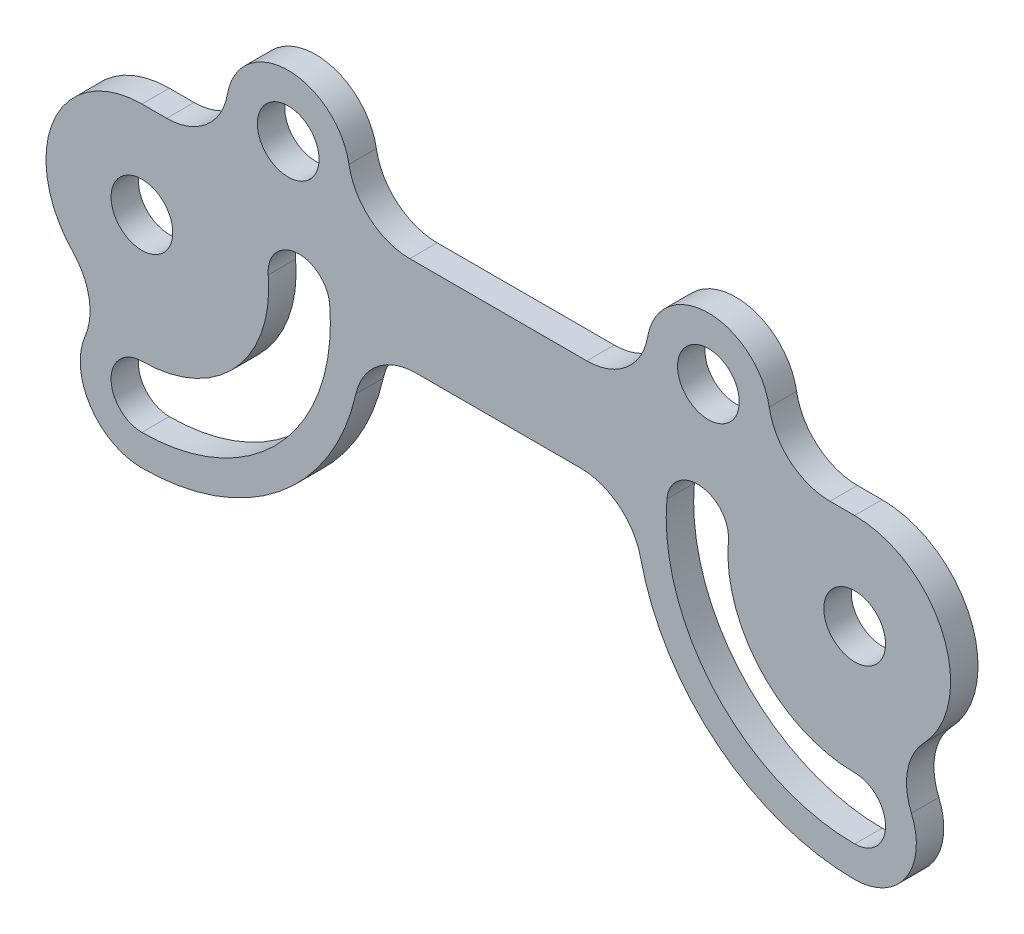
ISO-10303-21;
HEADER;
FILE_DESCRIPTION(('STEP AP214'),'2;1');
FILE_NAME('part.step','',(''),(''),'','','');
FILE_SCHEMA(('AUTOMOTIVE_DESIGN { 1 0 10303 214 1 1 1 1 }'));
ENDSEC;
DATA;
#1=APPLICATION_CONTEXT('core data for automotive mechanical design processes');
#2=APPLICATION_PROTOCOL_DEFINITION('international standard','automotive_design',2000,#1);
#3=PRODUCT_CONTEXT('',#1,'mechanical');
#4=PRODUCT('Part','Part','',(#3));
#5=PRODUCT_RELATED_PRODUCT_CATEGORY('part','',(#4));
#6=PRODUCT_DEFINITION_FORMATION('','',#4);
#7=PRODUCT_DEFINITION_CONTEXT('part definition',#1,'design');
#8=PRODUCT_DEFINITION('design','',#6,#7);
#9=PRODUCT_DEFINITION_SHAPE('','',#8);
#10=(LENGTH_UNIT() NAMED_UNIT(*) SI_UNIT(.MILLI.,.METRE.));
#11=(NAMED_UNIT(*) PLANE_ANGLE_UNIT() SI_UNIT($,.RADIAN.));
#12=(NAMED_UNIT(*) SI_UNIT($,.STERADIAN.) SOLID_ANGLE_UNIT());
#13=UNCERTAINTY_MEASURE_WITH_UNIT(LENGTH_MEASURE(1.E-05),#10,'distance_accuracy_value','');
#14=(GEOMETRIC_REPRESENTATION_CONTEXT(3) GLOBAL_UNCERTAINTY_ASSIGNED_CONTEXT((#13)) GLOBAL_UNIT_ASSIGNED_CONTEXT((#10,
#11,#12)) REPRESENTATION_CONTEXT('',''));
#15=CARTESIAN_POINT('',(0.,0.,0.));
#16=DIRECTION('',(0.,0.,1.));
#17=DIRECTION('',(1.,0.,0.));
#18=AXIS2_PLACEMENT_3D('',#15,#16,#17);
#19=CARTESIAN_POINT('',(0.,-9.128125,1.5875));
#20=DIRECTION('',(0.,0.,-1.));
#21=DIRECTION('',(-1.,0.,0.));
#22=AXIS2_PLACEMENT_3D('',#19,#20,#21);
#23=CYLINDRICAL_SURFACE('',#22,1.7859375);
#24=CARTESIAN_POINT('',(0.,-9.128125,0.));
#25=DIRECTION('',(0.,0.,1.));
#26=DIRECTION('',(1.,0.,0.));
#27=AXIS2_PLACEMENT_3D('',#24,#25,#26);
#28=CIRCLE('',#27,1.7859375);
#29=CARTESIAN_POINT('',(0.,-7.3421875,0.));
#30=VERTEX_POINT('',#29);
#31=CARTESIAN_POINT('',(0.,-10.9140625,0.));
#32=VERTEX_POINT('',#31);
#33=EDGE_CURVE('E346',#30,#32,#28,.T.);
#34=ORIENTED_EDGE('',*,*,#33,.F.);
#35=DIRECTION('',(0.,0.,-1.));
#36=VECTOR('',#35,1.);
#37=CARTESIAN_POINT('',(0.,-7.3421875,1.5875));
#38=LINE('',#37,#36);
#39=CARTESIAN_POINT('',(0.,-7.3421875,1.5875));
#40=VERTEX_POINT('',#39);
#41=EDGE_CURVE('E376',#40,#30,#38,.T.);
#42=ORIENTED_EDGE('',*,*,#41,.F.);
#43=CARTESIAN_POINT('',(0.,-9.128125,1.5875));
#44=DIRECTION('',(0.,0.,1.));
#45=DIRECTION('',(1.,0.,0.));
#46=AXIS2_PLACEMENT_3D('',#43,#44,#45);
#47=CIRCLE('',#46,1.7859375);
#48=CARTESIAN_POINT('',(0.,-10.9140625,1.5875));
#49=VERTEX_POINT('',#48);
#50=EDGE_CURVE('E282',#40,#49,#47,.T.);
#51=ORIENTED_EDGE('',*,*,#50,.T.);
#52=DIRECTION('',(0.,0.,-1.));
#53=VECTOR('',#52,1.);
#54=CARTESIAN_POINT('',(0.,-10.9140625,1.5875));
#55=LINE('',#54,#53);
#56=EDGE_CURVE('E369',#49,#32,#55,.T.);
#57=ORIENTED_EDGE('',*,*,#56,.T.);
#58=EDGE_LOOP('',(#34,#42,#51,#57));
#59=FACE_BOUND('',#58,.T.);
#60=ADVANCED_FACE('F38',(#59),#23,.F.);
#61=CARTESIAN_POINT('',(0.,0.,1.5875));
#62=DIRECTION('',(0.,0.,-1.));
#63=DIRECTION('',(-1.,0.,0.));
#64=AXIS2_PLACEMENT_3D('',#61,#62,#63);
#65=CYLINDRICAL_SURFACE('',#64,7.34218750000001);
#66=CARTESIAN_POINT('',(0.,0.,0.));
#67=DIRECTION('',(0.,0.,1.));
#68=DIRECTION('',(1.,0.,0.));
#69=AXIS2_PLACEMENT_3D('',#66,#67,#68);
#70=CIRCLE('',#69,7.34218750000001);
#71=CARTESIAN_POINT('',(7.31424825989548,0.6399138049551,0.));
#72=VERTEX_POINT('',#71);
#73=EDGE_CURVE('E349',#72,#30,#70,.F.);
#74=ORIENTED_EDGE('',*,*,#73,.F.);
#75=DIRECTION('',(0.,0.,-1.));
#76=VECTOR('',#75,1.);
#77=CARTESIAN_POINT('',(7.31424825989548,0.6399138049551,1.5875));
#78=LINE('',#77,#76);
#79=CARTESIAN_POINT('',(7.31424825989548,0.6399138049551,1.5875));
#80=VERTEX_POINT('',#79);
#81=EDGE_CURVE('E374',#80,#72,#78,.T.);
#82=ORIENTED_EDGE('',*,*,#81,.F.);
#83=CARTESIAN_POINT('',(0.,0.,1.5875));
#84=DIRECTION('',(0.,0.,1.));
#85=DIRECTION('',(1.,0.,0.));
#86=AXIS2_PLACEMENT_3D('',#83,#84,#85);
#87=CIRCLE('',#86,7.34218750000001);
#88=EDGE_CURVE('E285',#80,#40,#87,.F.);
#89=ORIENTED_EDGE('',*,*,#88,.T.);
#90=ORIENTED_EDGE('',*,*,#41,.T.);
#91=EDGE_LOOP('',(#74,#82,#89,#90));
#92=FACE_BOUND('',#91,.T.);
#93=ADVANCED_FACE('F519',(#92),#65,.T.);
#94=CARTESIAN_POINT('',(9.09338972851871,0.795568514268503,1.5875));
#95=DIRECTION('',(0.,0.,-1.));
#96=DIRECTION('',(-1.,0.,0.));
#97=AXIS2_PLACEMENT_3D('',#94,#95,#96);
#98=CYLINDRICAL_SURFACE('',#97,1.7859375);
#99=CARTESIAN_POINT('',(9.09338972851871,0.795568514268503,0.));
#100=DIRECTION('',(0.,0.,1.));
#101=DIRECTION('',(1.,0.,0.));
#102=AXIS2_PLACEMENT_3D('',#99,#100,#101);
#103=CIRCLE('',#102,1.7859375);
#104=CARTESIAN_POINT('',(10.8725311971419,0.951223223581906,0.));
#105=VERTEX_POINT('',#104);
#106=EDGE_CURVE('E352',#105,#72,#103,.T.);
#107=ORIENTED_EDGE('',*,*,#106,.F.);
#108=DIRECTION('',(0.,0.,-1.));
#109=VECTOR('',#108,1.);
#110=CARTESIAN_POINT('',(10.8725311971419,0.951223223581906,1.5875));
#111=LINE('',#110,#109);
#112=CARTESIAN_POINT('',(10.8725311971419,0.951223223581906,1.5875));
#113=VERTEX_POINT('',#112);
#114=EDGE_CURVE('E371',#113,#105,#111,.T.);
#115=ORIENTED_EDGE('',*,*,#114,.F.);
#116=CARTESIAN_POINT('',(9.09338972851871,0.795568514268503,1.5875));
#117=DIRECTION('',(0.,0.,1.));
#118=DIRECTION('',(1.,0.,0.));
#119=AXIS2_PLACEMENT_3D('',#116,#117,#118);
#120=CIRCLE('',#119,1.7859375);
#121=EDGE_CURVE('E288',#113,#80,#120,.T.);
#122=ORIENTED_EDGE('',*,*,#121,.T.);
#123=ORIENTED_EDGE('',*,*,#81,.T.);
#124=EDGE_LOOP('',(#107,#115,#122,#123));
#125=FACE_BOUND('',#124,.T.);
#126=ADVANCED_FACE('F525',(#125),#98,.F.);
#127=CARTESIAN_POINT('',(0.,0.,1.5875));
#128=DIRECTION('',(0.,0.,-1.));
#129=DIRECTION('',(-1.,0.,0.));
#130=AXIS2_PLACEMENT_3D('',#127,#128,#129);
#131=CYLINDRICAL_SURFACE('',#130,5.55625);
#132=CARTESIAN_POINT('',(0.,0.,0.));
#133=DIRECTION('',(0.,0.,1.));
#134=DIRECTION('',(1.,0.,0.));
#135=AXIS2_PLACEMENT_3D('',#132,#133,#134);
#136=CIRCLE('',#135,5.55625);
#137=CARTESIAN_POINT('',(0.,5.55625,0.));
#138=VERTEX_POINT('',#137);
#139=CARTESIAN_POINT('',(-4.00163634023209,-3.85471408317581,0.));
#140=VERTEX_POINT('',#139);
#141=EDGE_CURVE('E316',#138,#140,#136,.T.);
#142=ORIENTED_EDGE('',*,*,#141,.T.);
#143=DIRECTION('',(0.,0.,-1.));
#144=VECTOR('',#143,1.);
#145=CARTESIAN_POINT('',(-4.00163634023209,-3.85471408317581,1.5875));
#146=LINE('',#145,#144);
#147=CARTESIAN_POINT('',(-4.00163634023209,-3.85471408317581,1.5875));
#148=VERTEX_POINT('',#147);
#149=EDGE_CURVE('E426',#140,#148,#146,.F.);
#150=ORIENTED_EDGE('',*,*,#149,.T.);
#151=CARTESIAN_POINT('',(0.,0.,1.5875));
#152=DIRECTION('',(0.,0.,1.));
#153=DIRECTION('',(1.,0.,0.));
#154=AXIS2_PLACEMENT_3D('',#151,#152,#153);
#155=CIRCLE('',#154,5.55625);
#156=CARTESIAN_POINT('',(0.,5.55625,1.5875));
#157=VERTEX_POINT('',#156);
#158=EDGE_CURVE('E253',#157,#148,#155,.T.);
#159=ORIENTED_EDGE('',*,*,#158,.F.);
#160=DIRECTION('',(0.,0.,-1.));
#161=VECTOR('',#160,1.);
#162=CARTESIAN_POINT('',(0.,5.55625,1.5875));
#163=LINE('',#162,#161);
#164=EDGE_CURVE('E244',#157,#138,#163,.T.);
#165=ORIENTED_EDGE('',*,*,#164,.T.);
#166=EDGE_LOOP('',(#142,#150,#159,#165));
#167=FACE_BOUND('',#166,.T.);
#168=ADVANCED_FACE('F560',(#167),#131,.T.);
#169=CARTESIAN_POINT('',(0.,-9.128125,1.5875));
#170=DIRECTION('',(0.,0.,-1.));
#171=DIRECTION('',(-1.,0.,0.));
#172=AXIS2_PLACEMENT_3D('',#169,#170,#171);
#173=CYLINDRICAL_SURFACE('',#172,3.57187499999999);
#174=CARTESIAN_POINT('',(0.,-9.128125,1.5875));
#175=DIRECTION('',(0.,0.,1.));
#176=DIRECTION('',(1.,0.,0.));
#177=AXIS2_PLACEMENT_3D('',#174,#175,#176);
#178=CIRCLE('',#177,3.57187499999999);
#179=CARTESIAN_POINT('',(-3.2870584223335,-7.7304347826087,1.5875));
#180=VERTEX_POINT('',#179);
#181=CARTESIAN_POINT('',(0.,-12.7,1.5875));
#182=VERTEX_POINT('',#181);
#183=EDGE_CURVE('E256',#180,#182,#178,.T.);
#184=ORIENTED_EDGE('',*,*,#183,.F.);
#185=DIRECTION('',(0.,0.,-1.));
#186=VECTOR('',#185,1.);
#187=CARTESIAN_POINT('',(-3.2870584223335,-7.7304347826087,1.5875));
#188=LINE('',#187,#186);
#189=CARTESIAN_POINT('',(-3.2870584223335,-7.7304347826087,0.));
#190=VERTEX_POINT('',#189);
#191=EDGE_CURVE('E423',#180,#190,#188,.T.);
#192=ORIENTED_EDGE('',*,*,#191,.T.);
#193=CARTESIAN_POINT('',(0.,-9.128125,0.));
#194=DIRECTION('',(0.,0.,1.));
#195=DIRECTION('',(1.,0.,0.));
#196=AXIS2_PLACEMENT_3D('',#193,#194,#195);
#197=CIRCLE('',#196,3.57187499999999);
#198=CARTESIAN_POINT('',(0.,-12.7,0.));
#199=VERTEX_POINT('',#198);
#200=EDGE_CURVE('E319',#190,#199,#197,.T.);
#201=ORIENTED_EDGE('',*,*,#200,.T.);
#202=DIRECTION('',(0.,0.,-1.));
#203=VECTOR('',#202,1.);
#204=CARTESIAN_POINT('',(0.,-12.7,1.5875));
#205=LINE('',#204,#203);
#206=EDGE_CURVE('E372',#182,#199,#205,.T.);
#207=ORIENTED_EDGE('',*,*,#206,.F.);
#208=EDGE_LOOP('',(#184,#192,#201,#207));
#209=FACE_BOUND('',#208,.T.);
#210=ADVANCED_FACE('F556',(#209),#173,.T.);
#211=CARTESIAN_POINT('',(0.,0.,1.5875));
#212=DIRECTION('',(0.,0.,-1.));
#213=DIRECTION('',(-1.,0.,0.));
#214=AXIS2_PLACEMENT_3D('',#211,#212,#213);
#215=CYLINDRICAL_SURFACE('',#214,12.7);
#216=CARTESIAN_POINT('',(0.,0.,0.));
#217=DIRECTION('',(0.,0.,1.));
#218=DIRECTION('',(1.,0.,0.));
#219=AXIS2_PLACEMENT_3D('',#216,#217,#218);
#220=CIRCLE('',#219,12.7);
#221=CARTESIAN_POINT('',(12.390243902439,-2.78780487804878,0.));
#222=VERTEX_POINT('',#221);
#223=EDGE_CURVE('E321',#199,#222,#220,.T.);
#224=ORIENTED_EDGE('',*,*,#223,.T.);
#225=DIRECTION('',(0.,0.,-1.));
#226=VECTOR('',#225,1.);
#227=CARTESIAN_POINT('',(12.390243902439,-2.78780487804878,1.5875));
#228=LINE('',#227,#226);
#229=CARTESIAN_POINT('',(12.390243902439,-2.78780487804878,1.5875));
#230=VERTEX_POINT('',#229);
#231=EDGE_CURVE('E416',#222,#230,#228,.F.);
#232=ORIENTED_EDGE('',*,*,#231,.T.);
#233=CARTESIAN_POINT('',(0.,0.,1.5875));
#234=DIRECTION('',(0.,0.,1.));
#235=DIRECTION('',(1.,0.,0.));
#236=AXIS2_PLACEMENT_3D('',#233,#234,#235);
#237=CIRCLE('',#236,12.7);
#238=EDGE_CURVE('E258',#182,#230,#237,.T.);
#239=ORIENTED_EDGE('',*,*,#238,.F.);
#240=ORIENTED_EDGE('',*,*,#206,.T.);
#241=EDGE_LOOP('',(#224,#232,#239,#240));
#242=FACE_BOUND('',#241,.T.);
#243=ADVANCED_FACE('F552',(#242),#215,.T.);
#244=CARTESIAN_POINT('',(0.,0.,1.5875));
#245=DIRECTION('',(0.,1.,0.));
#246=DIRECTION('',(0.,0.,1.));
#247=AXIS2_PLACEMENT_3D('',#244,#245,#246);
#248=PLANE('',#247);
#249=DIRECTION('',(1.,0.,0.));
#250=VECTOR('',#249,1.);
#251=CARTESIAN_POINT('',(0.,0.,0.));
#252=LINE('',#251,#250);
#253=CARTESIAN_POINT('',(15.875,0.,0.));
#254=VERTEX_POINT('',#253);
#255=CARTESIAN_POINT('',(25.4000000000001,0.,0.));
#256=VERTEX_POINT('',#255);
#257=EDGE_CURVE('E324',#254,#256,#252,.T.);
#258=ORIENTED_EDGE('',*,*,#257,.T.);
#259=DIRECTION('',(0.,0.,1.));
#260=VECTOR('',#259,1.);
#261=CARTESIAN_POINT('',(25.4000000000001,0.,1.5875));
#262=LINE('',#261,#260);
#263=CARTESIAN_POINT('',(25.4000000000001,0.,1.5875));
#264=VERTEX_POINT('',#263);
#265=EDGE_CURVE('E414',#256,#264,#262,.T.);
#266=ORIENTED_EDGE('',*,*,#265,.T.);
#267=DIRECTION('',(1.,0.,0.));
#268=VECTOR('',#267,1.);
#269=CARTESIAN_POINT('',(0.,0.,1.5875));
#270=LINE('',#269,#268);
#271=CARTESIAN_POINT('',(15.875,0.,1.5875));
#272=VERTEX_POINT('',#271);
#273=EDGE_CURVE('E261',#272,#264,#270,.T.);
#274=ORIENTED_EDGE('',*,*,#273,.F.);
#275=DIRECTION('',(0.,0.,1.));
#276=VECTOR('',#275,1.);
#277=CARTESIAN_POINT('',(15.875,0.,0.));
#278=LINE('',#277,#276);
#279=EDGE_CURVE('E411',#272,#254,#278,.F.);
#280=ORIENTED_EDGE('',*,*,#279,.T.);
#281=EDGE_LOOP('',(#258,#266,#274,#280));
#282=FACE_BOUND('',#281,.T.);
#283=ADVANCED_FACE('F548',(#282),#248,.F.);
#284=CARTESIAN_POINT('',(41.275,0.,1.5875));
#285=DIRECTION('',(0.,0.,-1.));
#286=DIRECTION('',(-1.,0.,0.));
#287=AXIS2_PLACEMENT_3D('',#284,#285,#286);
#288=CYLINDRICAL_SURFACE('',#287,12.6999999999999);
#289=CARTESIAN_POINT('',(41.275,0.,1.5875));
#290=DIRECTION('',(0.,0.,1.));
#291=DIRECTION('',(1.,0.,0.));
#292=AXIS2_PLACEMENT_3D('',#289,#290,#291);
#293=CIRCLE('',#292,12.6999999999999);
#294=CARTESIAN_POINT('',(28.884756097561,-2.78780487804878,1.5875));
#295=VERTEX_POINT('',#294);
#296=CARTESIAN_POINT('',(41.275,-12.7,1.5875));
#297=VERTEX_POINT('',#296);
#298=EDGE_CURVE('E264',#295,#297,#293,.T.);
#299=ORIENTED_EDGE('',*,*,#298,.F.);
#300=DIRECTION('',(0.,0.,-1.));
#301=VECTOR('',#300,1.);
#302=CARTESIAN_POINT('',(28.884756097561,-2.78780487804878,1.5875));
#303=LINE('',#302,#301);
#304=CARTESIAN_POINT('',(28.884756097561,-2.78780487804878,0.));
#305=VERTEX_POINT('',#304);
#306=EDGE_CURVE('E408',#295,#305,#303,.T.);
#307=ORIENTED_EDGE('',*,*,#306,.T.);
#308=CARTESIAN_POINT('',(41.275,0.,0.));
#309=DIRECTION('',(0.,0.,1.));
#310=DIRECTION('',(1.,0.,0.));
#311=AXIS2_PLACEMENT_3D('',#308,#309,#310);
#312=CIRCLE('',#311,12.6999999999999);
#313=CARTESIAN_POINT('',(41.275,-12.7,0.));
#314=VERTEX_POINT('',#313);
#315=EDGE_CURVE('E327',#305,#314,#312,.T.);
#316=ORIENTED_EDGE('',*,*,#315,.T.);
#317=DIRECTION('',(0.,0.,-1.));
#318=VECTOR('',#317,1.);
#319=CARTESIAN_POINT('',(41.275,-12.7,1.5875));
#320=LINE('',#319,#318);
#321=EDGE_CURVE('E383',#297,#314,#320,.T.);
#322=ORIENTED_EDGE('',*,*,#321,.F.);
#323=EDGE_LOOP('',(#299,#307,#316,#322));
#324=FACE_BOUND('',#323,.T.);
#325=ADVANCED_FACE('F544',(#324),#288,.T.);
#326=CARTESIAN_POINT('',(41.275,-9.12812499999998,1.5875));
#327=DIRECTION('',(0.,0.,-1.));
#328=DIRECTION('',(-1.,0.,0.));
#329=AXIS2_PLACEMENT_3D('',#326,#327,#328);
#330=CYLINDRICAL_SURFACE('',#329,3.57187499999998);
#331=CARTESIAN_POINT('',(41.275,-9.12812499999998,0.));
#332=DIRECTION('',(0.,0.,1.));
#333=DIRECTION('',(1.,0.,0.));
#334=AXIS2_PLACEMENT_3D('',#331,#332,#333);
#335=CIRCLE('',#334,3.57187499999998);
#336=CARTESIAN_POINT('',(44.5620584223335,-7.73043478260869,0.));
#337=VERTEX_POINT('',#336);
#338=EDGE_CURVE('E329',#314,#337,#335,.T.);
#339=ORIENTED_EDGE('',*,*,#338,.T.);
#340=DIRECTION('',(0.,0.,-1.));
#341=VECTOR('',#340,1.);
#342=CARTESIAN_POINT('',(44.5620584223335,-7.73043478260869,1.5875));
#343=LINE('',#342,#341);
#344=CARTESIAN_POINT('',(44.5620584223335,-7.73043478260869,1.5875));
#345=VERTEX_POINT('',#344);
#346=EDGE_CURVE('E394',#337,#345,#343,.F.);
#347=ORIENTED_EDGE('',*,*,#346,.T.);
#348=CARTESIAN_POINT('',(41.275,-9.12812499999998,1.5875));
#349=DIRECTION('',(0.,0.,1.));
#350=DIRECTION('',(1.,0.,0.));
#351=AXIS2_PLACEMENT_3D('',#348,#349,#350);
#352=CIRCLE('',#351,3.57187499999998);
#353=EDGE_CURVE('E266',#297,#345,#352,.T.);
#354=ORIENTED_EDGE('',*,*,#353,.F.);
#355=ORIENTED_EDGE('',*,*,#321,.T.);
#356=EDGE_LOOP('',(#339,#347,#354,#355));
#357=FACE_BOUND('',#356,.T.);
#358=ADVANCED_FACE('F541',(#357),#330,.T.);
#359=CARTESIAN_POINT('',(41.275,0.,1.5875));
#360=DIRECTION('',(0.,0.,-1.));
#361=DIRECTION('',(-1.,0.,0.));
#362=AXIS2_PLACEMENT_3D('',#359,#360,#361);
#363=CYLINDRICAL_SURFACE('',#362,5.55624999999999);
#364=CARTESIAN_POINT('',(41.275,0.,1.5875));
#365=DIRECTION('',(0.,0.,1.));
#366=DIRECTION('',(1.,0.,0.));
#367=AXIS2_PLACEMENT_3D('',#364,#365,#366);
#368=CIRCLE('',#367,5.55624999999999);
#369=CARTESIAN_POINT('',(45.2766363402321,-3.8547140831758,1.5875));
#370=VERTEX_POINT('',#369);
#371=CARTESIAN_POINT('',(41.275,5.55625,1.5875));
#372=VERTEX_POINT('',#371);
#373=EDGE_CURVE('E269',#370,#372,#368,.T.);
#374=ORIENTED_EDGE('',*,*,#373,.F.);
#375=DIRECTION('',(0.,0.,-1.));
#376=VECTOR('',#375,1.);
#377=CARTESIAN_POINT('',(45.2766363402321,-3.8547140831758,1.5875));
#378=LINE('',#377,#376);
#379=CARTESIAN_POINT('',(45.2766363402321,-3.8547140831758,0.));
#380=VERTEX_POINT('',#379);
#381=EDGE_CURVE('E378',#370,#380,#378,.T.);
#382=ORIENTED_EDGE('',*,*,#381,.T.);
#383=CARTESIAN_POINT('',(41.275,0.,0.));
#384=DIRECTION('',(0.,0.,1.));
#385=DIRECTION('',(1.,0.,0.));
#386=AXIS2_PLACEMENT_3D('',#383,#384,#385);
#387=CIRCLE('',#386,5.55624999999999);
#388=CARTESIAN_POINT('',(41.275,5.55625,0.));
#389=VERTEX_POINT('',#388);
#390=EDGE_CURVE('E332',#380,#389,#387,.T.);
#391=ORIENTED_EDGE('',*,*,#390,.T.);
#392=DIRECTION('',(0.,0.,-1.));
#393=VECTOR('',#392,1.);
#394=CARTESIAN_POINT('',(41.275,5.55625,1.5875));
#395=LINE('',#394,#393);
#396=EDGE_CURVE('E380',#372,#389,#395,.T.);
#397=ORIENTED_EDGE('',*,*,#396,.F.);
#398=EDGE_LOOP('',(#374,#382,#391,#397));
#399=FACE_BOUND('',#398,.T.);
#400=ADVANCED_FACE('F483',(#399),#363,.T.);
#401=CARTESIAN_POINT('',(0.,5.55625,1.5875));
#402=DIRECTION('',(0.,1.,0.));
#403=DIRECTION('',(0.,0.,1.));
#404=AXIS2_PLACEMENT_3D('',#401,#402,#403);
#405=PLANE('',#404);
#406=DIRECTION('',(1.,0.,0.));
#407=VECTOR('',#406,1.);
#408=CARTESIAN_POINT('',(0.,5.55625,0.));
#409=LINE('',#408,#407);
#410=CARTESIAN_POINT('',(39.8437270237769,5.55625,0.));
#411=VERTEX_POINT('',#410);
#412=EDGE_CURVE('E335',#411,#389,#409,.T.);
#413=ORIENTED_EDGE('',*,*,#412,.F.);
#414=DIRECTION('',(0.,0.,-1.));
#415=VECTOR('',#414,1.);
#416=CARTESIAN_POINT('',(39.8437270237769,5.55625,1.5875));
#417=LINE('',#416,#415);
#418=CARTESIAN_POINT('',(39.8437270237769,5.55625,1.5875));
#419=VERTEX_POINT('',#418);
#420=EDGE_CURVE('E401',#411,#419,#417,.F.);
#421=ORIENTED_EDGE('',*,*,#420,.T.);
#422=DIRECTION('',(1.,0.,0.));
#423=VECTOR('',#422,1.);
#424=CARTESIAN_POINT('',(0.,5.55625,1.5875));
#425=LINE('',#424,#423);
#426=EDGE_CURVE('E272',#419,#372,#425,.T.);
#427=ORIENTED_EDGE('',*,*,#426,.T.);
#428=ORIENTED_EDGE('',*,*,#396,.T.);
#429=EDGE_LOOP('',(#413,#421,#427,#428));
#430=FACE_BOUND('',#429,.T.);
#431=ADVANCED_FACE('F474',(#430),#405,.T.);
#432=CARTESIAN_POINT('',(32.8042291087349,7.91213438876142,1.5875));
#433=DIRECTION('',(0.,0.,-1.));
#434=DIRECTION('',(-1.,0.,0.));
#435=AXIS2_PLACEMENT_3D('',#432,#433,#434);
#436=CYLINDRICAL_SURFACE('',#435,3.57187500000001);
#437=CARTESIAN_POINT('',(32.8042291087349,7.91213438876142,1.5875));
#438=DIRECTION('',(0.,0.,1.));
#439=DIRECTION('',(1.,0.,0.));
#440=AXIS2_PLACEMENT_3D('',#437,#438,#439);
#441=CIRCLE('',#440,3.57187500000001);
#442=CARTESIAN_POINT('',(36.3239780662559,8.52012969438071,1.5875));
#443=VERTEX_POINT('',#442);
#444=CARTESIAN_POINT('',(29.2844801512139,8.52012969438071,1.5875));
#445=VERTEX_POINT('',#444);
#446=EDGE_CURVE('E277',#443,#445,#441,.T.);
#447=ORIENTED_EDGE('',*,*,#446,.F.);
#448=DIRECTION('',(0.,0.,-1.));
#449=VECTOR('',#448,1.);
#450=CARTESIAN_POINT('',(36.3239780662559,8.52012969438071,1.5875));
#451=LINE('',#450,#449);
#452=CARTESIAN_POINT('',(36.3239780662559,8.52012969438071,0.));
#453=VERTEX_POINT('',#452);
#454=EDGE_CURVE('E398',#443,#453,#451,.T.);
#455=ORIENTED_EDGE('',*,*,#454,.T.);
#456=CARTESIAN_POINT('',(32.8042291087349,7.91213438876142,0.));
#457=DIRECTION('',(0.,0.,1.));
#458=DIRECTION('',(1.,0.,0.));
#459=AXIS2_PLACEMENT_3D('',#456,#457,#458);
#460=CIRCLE('',#459,3.57187500000001);
#461=CARTESIAN_POINT('',(29.2844801512139,8.52012969438071,0.));
#462=VERTEX_POINT('',#461);
#463=EDGE_CURVE('E340',#453,#462,#460,.T.);
#464=ORIENTED_EDGE('',*,*,#463,.T.);
#465=DIRECTION('',(0.,0.,-1.));
#466=VECTOR('',#465,1.);
#467=CARTESIAN_POINT('',(29.2844801512139,8.52012969438071,1.5875));
#468=LINE('',#467,#466);
#469=EDGE_CURVE('E396',#462,#445,#468,.F.);
#470=ORIENTED_EDGE('',*,*,#469,.T.);
#471=EDGE_LOOP('',(#447,#455,#464,#470));
#472=FACE_BOUND('',#471,.T.);
#473=ADVANCED_FACE('F493',(#472),#436,.T.);
#474=CARTESIAN_POINT('',(15.510268806307,5.55625,1.5875));
#475=VERTEX_POINT('',#474);
#476=CARTESIAN_POINT('',(25.764731193693,5.55625,1.5875));
#477=VERTEX_POINT('',#476);
#478=EDGE_CURVE('E273',#475,#477,#425,.T.);
#479=ORIENTED_EDGE('',*,*,#478,.T.);
#480=DIRECTION('',(0.,0.,-1.));
#481=VECTOR('',#480,1.);
#482=CARTESIAN_POINT('',(25.764731193693,5.55625,1.5875));
#483=LINE('',#482,#481);
#484=CARTESIAN_POINT('',(25.764731193693,5.55625,0.));
#485=VERTEX_POINT('',#484);
#486=EDGE_CURVE('E405',#477,#485,#483,.T.);
#487=ORIENTED_EDGE('',*,*,#486,.T.);
#488=CARTESIAN_POINT('',(15.510268806307,5.55625,0.));
#489=VERTEX_POINT('',#488);
#490=EDGE_CURVE('E336',#489,#485,#409,.T.);
#491=ORIENTED_EDGE('',*,*,#490,.F.);
#492=DIRECTION('',(0.,0.,-1.));
#493=VECTOR('',#492,1.);
#494=CARTESIAN_POINT('',(15.510268806307,5.55625,1.5875));
#495=LINE('',#494,#493);
#496=EDGE_CURVE('E403',#489,#475,#495,.F.);
#497=ORIENTED_EDGE('',*,*,#496,.T.);
#498=EDGE_LOOP('',(#479,#487,#491,#497));
#499=FACE_BOUND('',#498,.T.);
#500=ADVANCED_FACE('F501',(#499),#405,.T.);
#501=CARTESIAN_POINT('',(8.4707708912651,7.91213438876139,1.5875));
#502=DIRECTION('',(0.,0.,-1.));
#503=DIRECTION('',(-1.,0.,0.));
#504=AXIS2_PLACEMENT_3D('',#501,#502,#503);
#505=CYLINDRICAL_SURFACE('',#504,3.57187499999998);
#506=CARTESIAN_POINT('',(8.4707708912651,7.91213438876139,1.5875));
#507=DIRECTION('',(0.,0.,1.));
#508=DIRECTION('',(1.,0.,0.));
#509=AXIS2_PLACEMENT_3D('',#506,#507,#508);
#510=CIRCLE('',#509,3.57187499999998);
#511=CARTESIAN_POINT('',(11.990519848786,8.52012969438069,1.5875));
#512=VERTEX_POINT('',#511);
#513=CARTESIAN_POINT('',(4.95102193374416,8.52012969438069,1.5875));
#514=VERTEX_POINT('',#513);
#515=EDGE_CURVE('E276',#512,#514,#510,.T.);
#516=ORIENTED_EDGE('',*,*,#515,.F.);
#517=DIRECTION('',(0.,0.,-1.));
#518=VECTOR('',#517,1.);
#519=CARTESIAN_POINT('',(11.990519848786,8.52012969438069,1.5875));
#520=LINE('',#519,#518);
#521=CARTESIAN_POINT('',(11.990519848786,8.52012969438069,0.));
#522=VERTEX_POINT('',#521);
#523=EDGE_CURVE('E420',#512,#522,#520,.T.);
#524=ORIENTED_EDGE('',*,*,#523,.T.);
#525=CARTESIAN_POINT('',(8.4707708912651,7.91213438876139,0.));
#526=DIRECTION('',(0.,0.,1.));
#527=DIRECTION('',(1.,0.,0.));
#528=AXIS2_PLACEMENT_3D('',#525,#526,#527);
#529=CIRCLE('',#528,3.57187499999998);
#530=CARTESIAN_POINT('',(4.95102193374416,8.52012969438069,0.));
#531=VERTEX_POINT('',#530);
#532=EDGE_CURVE('E339',#522,#531,#529,.T.);
#533=ORIENTED_EDGE('',*,*,#532,.T.);
#534=DIRECTION('',(0.,0.,-1.));
#535=VECTOR('',#534,1.);
#536=CARTESIAN_POINT('',(4.95102193374416,8.52012969438069,1.5875));
#537=LINE('',#536,#535);
#538=EDGE_CURVE('E418',#531,#514,#537,.F.);
#539=ORIENTED_EDGE('',*,*,#538,.T.);
#540=EDGE_LOOP('',(#516,#524,#533,#539));
#541=FACE_BOUND('',#540,.T.);
#542=ADVANCED_FACE('F466',(#541),#505,.T.);
#543=CARTESIAN_POINT('',(41.275,0.,1.5875));
#544=DIRECTION('',(0.,0.,-1.));
#545=DIRECTION('',(-1.,0.,0.));
#546=AXIS2_PLACEMENT_3D('',#543,#544,#545);
#547=CYLINDRICAL_SURFACE('',#546,7.34218749999998);
#548=CARTESIAN_POINT('',(41.275,0.,0.));
#549=DIRECTION('',(0.,0.,1.));
#550=DIRECTION('',(1.,0.,0.));
#551=AXIS2_PLACEMENT_3D('',#548,#549,#550);
#552=CIRCLE('',#551,7.34218749999998);
#553=CARTESIAN_POINT('',(33.9607517401045,0.639913804955094,0.));
#554=VERTEX_POINT('',#553);
#555=CARTESIAN_POINT('',(41.275,-7.34218749999998,0.));
#556=VERTEX_POINT('',#555);
#557=EDGE_CURVE('E240',#554,#556,#552,.T.);
#558=ORIENTED_EDGE('',*,*,#557,.T.);
#559=DIRECTION('',(0.,0.,-1.));
#560=VECTOR('',#559,1.);
#561=CARTESIAN_POINT('',(41.275,-7.34218749999998,1.5875));
#562=LINE('',#561,#560);
#563=CARTESIAN_POINT('',(41.275,-7.34218749999998,1.5875));
#564=VERTEX_POINT('',#563);
#565=EDGE_CURVE('E237',#564,#556,#562,.T.);
#566=ORIENTED_EDGE('',*,*,#565,.F.);
#567=CARTESIAN_POINT('',(41.275,0.,1.5875));
#568=DIRECTION('',(0.,0.,1.));
#569=DIRECTION('',(1.,0.,0.));
#570=AXIS2_PLACEMENT_3D('',#567,#568,#569);
#571=CIRCLE('',#570,7.34218749999998);
#572=CARTESIAN_POINT('',(33.9607517401045,0.639913804955094,1.5875));
#573=VERTEX_POINT('',#572);
#574=EDGE_CURVE('E224',#573,#564,#571,.T.);
#575=ORIENTED_EDGE('',*,*,#574,.F.);
#576=DIRECTION('',(0.,0.,-1.));
#577=VECTOR('',#576,1.);
#578=CARTESIAN_POINT('',(33.9607517401045,0.639913804955094,1.5875));
#579=LINE('',#578,#577);
#580=EDGE_CURVE('E306',#573,#554,#579,.T.);
#581=ORIENTED_EDGE('',*,*,#580,.T.);
#582=EDGE_LOOP('',(#558,#566,#575,#581));
#583=FACE_BOUND('',#582,.T.);
#584=ADVANCED_FACE('F238',(#583),#547,.T.);
#585=CARTESIAN_POINT('',(41.275,-9.12812499999998,1.5875));
#586=DIRECTION('',(0.,0.,-1.));
#587=DIRECTION('',(-1.,0.,0.));
#588=AXIS2_PLACEMENT_3D('',#585,#586,#587);
#589=CYLINDRICAL_SURFACE('',#588,1.7859375);
#590=CARTESIAN_POINT('',(41.275,-9.12812499999998,0.));
#591=DIRECTION('',(0.,0.,1.));
#592=DIRECTION('',(1.,0.,0.));
#593=AXIS2_PLACEMENT_3D('',#590,#591,#592);
#594=CIRCLE('',#593,1.7859375);
#595=CARTESIAN_POINT('',(41.275,-10.9140625,0.));
#596=VERTEX_POINT('',#595);
#597=EDGE_CURVE('E308',#596,#556,#594,.T.);
#598=ORIENTED_EDGE('',*,*,#597,.F.);
#599=DIRECTION('',(0.,0.,-1.));
#600=VECTOR('',#599,1.);
#601=CARTESIAN_POINT('',(41.275,-10.9140625,1.5875));
#602=LINE('',#601,#600);
#603=CARTESIAN_POINT('',(41.275,-10.9140625,1.5875));
#604=VERTEX_POINT('',#603);
#605=EDGE_CURVE('E245',#604,#596,#602,.T.);
#606=ORIENTED_EDGE('',*,*,#605,.F.);
#607=CARTESIAN_POINT('',(41.275,-9.12812499999998,1.5875));
#608=DIRECTION('',(0.,0.,1.));
#609=DIRECTION('',(1.,0.,0.));
#610=AXIS2_PLACEMENT_3D('',#607,#608,#609);
#611=CIRCLE('',#610,1.7859375);
#612=EDGE_CURVE('E229',#604,#564,#611,.T.);
#613=ORIENTED_EDGE('',*,*,#612,.T.);
#614=ORIENTED_EDGE('',*,*,#565,.T.);
#615=EDGE_LOOP('',(#598,#606,#613,#614));
#616=FACE_BOUND('',#615,.T.);
#617=ADVANCED_FACE('F247',(#616),#589,.F.);
#618=CARTESIAN_POINT('',(41.275,0.,1.5875));
#619=DIRECTION('',(0.,0.,-1.));
#620=DIRECTION('',(-1.,0.,0.));
#621=AXIS2_PLACEMENT_3D('',#618,#619,#620);
#622=CYLINDRICAL_SURFACE('',#621,10.9140625);
#623=CARTESIAN_POINT('',(41.275,0.,0.));
#624=DIRECTION('',(0.,0.,1.));
#625=DIRECTION('',(1.,0.,0.));
#626=AXIS2_PLACEMENT_3D('',#623,#624,#625);
#627=CIRCLE('',#626,10.9140625);
#628=CARTESIAN_POINT('',(30.4024688028581,0.951223223581898,0.));
#629=VERTEX_POINT('',#628);
#630=EDGE_CURVE('E310',#629,#596,#627,.T.);
#631=ORIENTED_EDGE('',*,*,#630,.F.);
#632=DIRECTION('',(0.,0.,-1.));
#633=VECTOR('',#632,1.);
#634=CARTESIAN_POINT('',(30.4024688028581,0.951223223581898,1.5875));
#635=LINE('',#634,#633);
#636=CARTESIAN_POINT('',(30.4024688028581,0.951223223581898,1.5875));
#637=VERTEX_POINT('',#636);
#638=EDGE_CURVE('E389',#637,#629,#635,.T.);
#639=ORIENTED_EDGE('',*,*,#638,.F.);
#640=CARTESIAN_POINT('',(41.275,0.,1.5875));
#641=DIRECTION('',(0.,0.,1.));
#642=DIRECTION('',(1.,0.,0.));
#643=AXIS2_PLACEMENT_3D('',#640,#641,#642);
#644=CIRCLE('',#643,10.9140625);
#645=EDGE_CURVE('E248',#637,#604,#644,.T.);
#646=ORIENTED_EDGE('',*,*,#645,.T.);
#647=ORIENTED_EDGE('',*,*,#605,.T.);
#648=EDGE_LOOP('',(#631,#639,#646,#647));
#649=FACE_BOUND('',#648,.T.);
#650=ADVANCED_FACE('F569',(#649),#622,.F.);
#651=CARTESIAN_POINT('',(8.4707708912651,7.91213438876139,1.5875));
#652=DIRECTION('',(0.,0.,-1.));
#653=DIRECTION('',(-1.,0.,0.));
#654=AXIS2_PLACEMENT_3D('',#651,#652,#653);
#655=CYLINDRICAL_SURFACE('',#654,1.78593749999998);
#656=CARTESIAN_POINT('',(8.4707708912651,7.91213438876139,1.5875));
#657=DIRECTION('',(0.,0.,1.));
#658=DIRECTION('',(1.,0.,0.));
#659=AXIS2_PLACEMENT_3D('',#656,#657,#658);
#660=CIRCLE('',#659,1.78593749999998);
#661=CARTESIAN_POINT('',(10.2567083912651,7.91213438876139,1.5875));
#662=VERTEX_POINT('',#661);
#663=EDGE_CURVE('E300',#662,#662,#660,.T.);
#664=ORIENTED_EDGE('',*,*,#663,.T.);
#665=EDGE_LOOP('',(#664));
#666=FACE_BOUND('',#665,.T.);
#667=CARTESIAN_POINT('',(8.4707708912651,7.91213438876139,0.));
#668=DIRECTION('',(0.,0.,1.));
#669=DIRECTION('',(1.,0.,0.));
#670=AXIS2_PLACEMENT_3D('',#667,#668,#669);
#671=CIRCLE('',#670,1.78593749999998);
#672=CARTESIAN_POINT('',(10.2567083912651,7.91213438876139,0.));
#673=VERTEX_POINT('',#672);
#674=EDGE_CURVE('E364',#673,#673,#671,.T.);
#675=ORIENTED_EDGE('',*,*,#674,.F.);
#676=EDGE_LOOP('',(#675));
#677=FACE_BOUND('',#676,.T.);
#678=ADVANCED_FACE('F572',(#666,#677),#655,.F.);
#679=CARTESIAN_POINT('',(41.275,0.,1.5875));
#680=DIRECTION('',(0.,0.,-1.));
#681=DIRECTION('',(-1.,0.,0.));
#682=AXIS2_PLACEMENT_3D('',#679,#680,#681);
#683=CYLINDRICAL_SURFACE('',#682,1.7859375);
#684=CARTESIAN_POINT('',(41.275,0.,1.5875));
#685=DIRECTION('',(0.,0.,1.));
#686=DIRECTION('',(1.,0.,0.));
#687=AXIS2_PLACEMENT_3D('',#684,#685,#686);
#688=CIRCLE('',#687,1.7859375);
#689=CARTESIAN_POINT('',(43.0609375,0.,1.5875));
#690=VERTEX_POINT('',#689);
#691=EDGE_CURVE('E297',#690,#690,#688,.T.);
#692=ORIENTED_EDGE('',*,*,#691,.T.);
#693=EDGE_LOOP('',(#692));
#694=FACE_BOUND('',#693,.T.);
#695=CARTESIAN_POINT('',(41.275,0.,0.));
#696=DIRECTION('',(0.,0.,1.));
#697=DIRECTION('',(1.,0.,0.));
#698=AXIS2_PLACEMENT_3D('',#695,#696,#697);
#699=CIRCLE('',#698,1.7859375);
#700=CARTESIAN_POINT('',(43.0609375,0.,0.));
#701=VERTEX_POINT('',#700);
#702=EDGE_CURVE('E361',#701,#701,#699,.T.);
#703=ORIENTED_EDGE('',*,*,#702,.F.);
#704=EDGE_LOOP('',(#703));
#705=FACE_BOUND('',#704,.T.);
#706=ADVANCED_FACE('F786',(#694,#705),#683,.F.);
#707=CARTESIAN_POINT('',(0.,0.,1.5875));
#708=DIRECTION('',(0.,0.,-1.));
#709=DIRECTION('',(-1.,0.,0.));
#710=AXIS2_PLACEMENT_3D('',#707,#708,#709);
#711=CYLINDRICAL_SURFACE('',#710,1.7859375);
#712=CARTESIAN_POINT('',(0.,0.,1.5875));
#713=DIRECTION('',(0.,0.,1.));
#714=DIRECTION('',(1.,0.,0.));
#715=AXIS2_PLACEMENT_3D('',#712,#713,#714);
#716=CIRCLE('',#715,1.7859375);
#717=CARTESIAN_POINT('',(1.7859375,0.,1.5875));
#718=VERTEX_POINT('',#717);
#719=EDGE_CURVE('E294',#718,#718,#716,.T.);
#720=ORIENTED_EDGE('',*,*,#719,.T.);
#721=EDGE_LOOP('',(#720));
#722=FACE_BOUND('',#721,.T.);
#723=CARTESIAN_POINT('',(0.,0.,0.));
#724=DIRECTION('',(0.,0.,1.));
#725=DIRECTION('',(1.,0.,0.));
#726=AXIS2_PLACEMENT_3D('',#723,#724,#725);
#727=CIRCLE('',#726,1.7859375);
#728=CARTESIAN_POINT('',(1.7859375,0.,0.));
#729=VERTEX_POINT('',#728);
#730=EDGE_CURVE('E358',#729,#729,#727,.T.);
#731=ORIENTED_EDGE('',*,*,#730,.F.);
#732=EDGE_LOOP('',(#731));
#733=FACE_BOUND('',#732,.T.);
#734=ADVANCED_FACE('F776',(#722,#733),#711,.F.);
#735=CARTESIAN_POINT('',(0.,0.,1.5875));
#736=DIRECTION('',(0.,0.,-1.));
#737=DIRECTION('',(-1.,0.,0.));
#738=AXIS2_PLACEMENT_3D('',#735,#736,#737);
#739=CYLINDRICAL_SURFACE('',#738,10.9140625);
#740=CARTESIAN_POINT('',(0.,0.,0.));
#741=DIRECTION('',(0.,0.,1.));
#742=DIRECTION('',(1.,0.,0.));
#743=AXIS2_PLACEMENT_3D('',#740,#741,#742);
#744=CIRCLE('',#743,10.9140625);
#745=EDGE_CURVE('E355',#32,#105,#744,.T.);
#746=ORIENTED_EDGE('',*,*,#745,.F.);
#747=ORIENTED_EDGE('',*,*,#56,.F.);
#748=CARTESIAN_POINT('',(0.,0.,1.5875));
#749=DIRECTION('',(0.,0.,1.));
#750=DIRECTION('',(1.,0.,0.));
#751=AXIS2_PLACEMENT_3D('',#748,#749,#750);
#752=CIRCLE('',#751,10.9140625);
#753=EDGE_CURVE('E291',#49,#113,#752,.T.);
#754=ORIENTED_EDGE('',*,*,#753,.T.);
#755=ORIENTED_EDGE('',*,*,#114,.T.);
#756=EDGE_LOOP('',(#746,#747,#754,#755));
#757=FACE_BOUND('',#756,.T.);
#758=ADVANCED_FACE('F534',(#757),#739,.F.);
#759=CARTESIAN_POINT('',(1.4312729762232,5.55625,1.5875));
#760=VERTEX_POINT('',#759);
#761=EDGE_CURVE('E278',#157,#760,#425,.T.);
#762=ORIENTED_EDGE('',*,*,#761,.T.);
#763=DIRECTION('',(0.,0.,-1.));
#764=VECTOR('',#763,1.);
#765=CARTESIAN_POINT('',(1.4312729762232,5.55625,1.5875));
#766=LINE('',#765,#764);
#767=CARTESIAN_POINT('',(1.4312729762232,5.55625,0.));
#768=VERTEX_POINT('',#767);
#769=EDGE_CURVE('E428',#760,#768,#766,.T.);
#770=ORIENTED_EDGE('',*,*,#769,.T.);
#771=EDGE_CURVE('E341',#138,#768,#409,.T.);
#772=ORIENTED_EDGE('',*,*,#771,.F.);
#773=ORIENTED_EDGE('',*,*,#164,.F.);
#774=EDGE_LOOP('',(#762,#770,#772,#773));
#775=FACE_BOUND('',#774,.T.);
#776=ADVANCED_FACE('F469',(#775),#405,.T.);
#777=CARTESIAN_POINT('',(32.1816102714813,0.795568514268496,1.5875));
#778=DIRECTION('',(0.,0.,-1.));
#779=DIRECTION('',(-1.,0.,0.));
#780=AXIS2_PLACEMENT_3D('',#777,#778,#779);
#781=CYLINDRICAL_SURFACE('',#780,1.7859375);
#782=CARTESIAN_POINT('',(32.1816102714813,0.795568514268496,0.));
#783=DIRECTION('',(0.,0.,1.));
#784=DIRECTION('',(1.,0.,0.));
#785=AXIS2_PLACEMENT_3D('',#782,#783,#784);
#786=CIRCLE('',#785,1.7859375);
#787=EDGE_CURVE('E313',#554,#629,#786,.T.);
#788=ORIENTED_EDGE('',*,*,#787,.F.);
#789=ORIENTED_EDGE('',*,*,#580,.F.);
#790=CARTESIAN_POINT('',(32.1816102714813,0.795568514268496,1.5875));
#791=DIRECTION('',(0.,0.,1.));
#792=DIRECTION('',(1.,0.,0.));
#793=AXIS2_PLACEMENT_3D('',#790,#791,#792);
#794=CIRCLE('',#793,1.7859375);
#795=EDGE_CURVE('E232',#573,#637,#794,.T.);
#796=ORIENTED_EDGE('',*,*,#795,.T.);
#797=ORIENTED_EDGE('',*,*,#638,.T.);
#798=EDGE_LOOP('',(#788,#789,#796,#797));
#799=FACE_BOUND('',#798,.T.);
#800=ADVANCED_FACE('F533',(#799),#781,.F.);
#801=CARTESIAN_POINT('',(32.8042291087349,7.91213438876142,1.5875));
#802=DIRECTION('',(0.,0.,-1.));
#803=DIRECTION('',(-1.,0.,0.));
#804=AXIS2_PLACEMENT_3D('',#801,#802,#803);
#805=CYLINDRICAL_SURFACE('',#804,1.78593750000002);
#806=CARTESIAN_POINT('',(32.8042291087349,7.91213438876142,1.5875));
#807=DIRECTION('',(0.,0.,1.));
#808=DIRECTION('',(1.,0.,0.));
#809=AXIS2_PLACEMENT_3D('',#806,#807,#808);
#810=CIRCLE('',#809,1.78593750000002);
#811=CARTESIAN_POINT('',(34.5901666087349,7.91213438876142,1.5875));
#812=VERTEX_POINT('',#811);
#813=EDGE_CURVE('E303',#812,#812,#810,.T.);
#814=ORIENTED_EDGE('',*,*,#813,.T.);
#815=EDGE_LOOP('',(#814));
#816=FACE_BOUND('',#815,.T.);
#817=CARTESIAN_POINT('',(32.8042291087349,7.91213438876142,0.));
#818=DIRECTION('',(0.,0.,1.));
#819=DIRECTION('',(1.,0.,0.));
#820=AXIS2_PLACEMENT_3D('',#817,#818,#819);
#821=CIRCLE('',#820,1.78593750000002);
#822=CARTESIAN_POINT('',(34.5901666087349,7.91213438876142,0.));
#823=VERTEX_POINT('',#822);
#824=EDGE_CURVE('E234',#823,#823,#821,.T.);
#825=ORIENTED_EDGE('',*,*,#824,.F.);
#826=EDGE_LOOP('',(#825));
#827=FACE_BOUND('',#826,.T.);
#828=ADVANCED_FACE('F567',(#816,#827),#805,.F.);
#829=CARTESIAN_POINT('',(0.,0.,1.5875));
#830=DIRECTION('',(0.,0.,1.));
#831=DIRECTION('',(1.,0.,0.));
#832=AXIS2_PLACEMENT_3D('',#829,#830,#831);
#833=PLANE('',#832);
#834=ORIENTED_EDGE('',*,*,#574,.T.);
#835=ORIENTED_EDGE('',*,*,#612,.F.);
#836=ORIENTED_EDGE('',*,*,#645,.F.);
#837=ORIENTED_EDGE('',*,*,#795,.F.);
#838=EDGE_LOOP('',(#834,#835,#836,#837));
#839=FACE_BOUND('',#838,.T.);
#840=ORIENTED_EDGE('',*,*,#158,.T.);
#841=CARTESIAN_POINT('',(-6.57411684466701,-6.33274456521739,1.5875));
#842=DIRECTION('',(0.,0.,1.));
#843=DIRECTION('',(1.,0.,0.));
#844=AXIS2_PLACEMENT_3D('',#841,#842,#843);
#845=CIRCLE('',#844,3.571875);
#846=EDGE_CURVE('E456',#148,#180,#845,.F.);
#847=ORIENTED_EDGE('',*,*,#846,.T.);
#848=ORIENTED_EDGE('',*,*,#183,.T.);
#849=ORIENTED_EDGE('',*,*,#238,.T.);
#850=CARTESIAN_POINT('',(15.875,-3.571875,1.5875));
#851=DIRECTION('',(0.,0.,1.));
#852=DIRECTION('',(1.,0.,0.));
#853=AXIS2_PLACEMENT_3D('',#850,#851,#852);
#854=CIRCLE('',#853,3.571875);
#855=EDGE_CURVE('E448',#230,#272,#854,.F.);
#856=ORIENTED_EDGE('',*,*,#855,.T.);
#857=ORIENTED_EDGE('',*,*,#273,.T.);
#858=CARTESIAN_POINT('',(25.4000000000001,-3.571875,1.5875));
#859=DIRECTION('',(0.,0.,1.));
#860=DIRECTION('',(1.,0.,0.));
#861=AXIS2_PLACEMENT_3D('',#858,#859,#860);
#862=CIRCLE('',#861,3.571875);
#863=EDGE_CURVE('E444',#264,#295,#862,.F.);
#864=ORIENTED_EDGE('',*,*,#863,.T.);
#865=ORIENTED_EDGE('',*,*,#298,.T.);
#866=ORIENTED_EDGE('',*,*,#353,.T.);
#867=CARTESIAN_POINT('',(47.849116844667,-6.33274456521739,1.5875));
#868=DIRECTION('',(0.,0.,1.));
#869=DIRECTION('',(1.,0.,0.));
#870=AXIS2_PLACEMENT_3D('',#867,#868,#869);
#871=CIRCLE('',#870,3.571875);
#872=EDGE_CURVE('E432',#345,#370,#871,.F.);
#873=ORIENTED_EDGE('',*,*,#872,.T.);
#874=ORIENTED_EDGE('',*,*,#373,.T.);
#875=ORIENTED_EDGE('',*,*,#426,.F.);
#876=CARTESIAN_POINT('',(39.8437270237769,9.128125,1.5875));
#877=DIRECTION('',(0.,0.,1.));
#878=DIRECTION('',(1.,0.,0.));
#879=AXIS2_PLACEMENT_3D('',#876,#877,#878);
#880=CIRCLE('',#879,3.571875);
#881=EDGE_CURVE('E436',#419,#443,#880,.F.);
#882=ORIENTED_EDGE('',*,*,#881,.T.);
#883=ORIENTED_EDGE('',*,*,#446,.T.);
#884=CARTESIAN_POINT('',(25.764731193693,9.128125,1.5875));
#885=DIRECTION('',(0.,0.,1.));
#886=DIRECTION('',(1.,0.,0.));
#887=AXIS2_PLACEMENT_3D('',#884,#885,#886);
#888=CIRCLE('',#887,3.571875);
#889=EDGE_CURVE('E440',#445,#477,#888,.F.);
#890=ORIENTED_EDGE('',*,*,#889,.T.);
#891=ORIENTED_EDGE('',*,*,#478,.F.);
#892=CARTESIAN_POINT('',(15.510268806307,9.128125,1.5875));
#893=DIRECTION('',(0.,0.,1.));
#894=DIRECTION('',(1.,0.,0.));
#895=AXIS2_PLACEMENT_3D('',#892,#893,#894);
#896=CIRCLE('',#895,3.571875);
#897=EDGE_CURVE('E452',#475,#512,#896,.F.);
#898=ORIENTED_EDGE('',*,*,#897,.T.);
#899=ORIENTED_EDGE('',*,*,#515,.T.);
#900=CARTESIAN_POINT('',(1.4312729762232,9.128125,1.5875));
#901=DIRECTION('',(0.,0.,1.));
#902=DIRECTION('',(1.,0.,0.));
#903=AXIS2_PLACEMENT_3D('',#900,#901,#902);
#904=CIRCLE('',#903,3.571875);
#905=EDGE_CURVE('E11',#514,#760,#904,.F.);
#906=ORIENTED_EDGE('',*,*,#905,.T.);
#907=ORIENTED_EDGE('',*,*,#761,.F.);
#908=EDGE_LOOP('',(#840,#847,#848,#849,#856,#857,#864,#865,#866,#873,#874,#875,#882,#883,#890,
#891,#898,#899,#906,#907));
#909=FACE_BOUND('',#908,.T.);
#910=ORIENTED_EDGE('',*,*,#50,.F.);
#911=ORIENTED_EDGE('',*,*,#88,.F.);
#912=ORIENTED_EDGE('',*,*,#121,.F.);
#913=ORIENTED_EDGE('',*,*,#753,.F.);
#914=EDGE_LOOP('',(#910,#911,#912,#913));
#915=FACE_BOUND('',#914,.T.);
#916=ORIENTED_EDGE('',*,*,#719,.F.);
#917=EDGE_LOOP('',(#916));
#918=FACE_BOUND('',#917,.T.);
#919=ORIENTED_EDGE('',*,*,#691,.F.);
#920=EDGE_LOOP('',(#919));
#921=FACE_BOUND('',#920,.T.);
#922=ORIENTED_EDGE('',*,*,#663,.F.);
#923=EDGE_LOOP('',(#922));
#924=FACE_BOUND('',#923,.T.);
#925=ORIENTED_EDGE('',*,*,#813,.F.);
#926=EDGE_LOOP('',(#925));
#927=FACE_BOUND('',#926,.T.);
#928=ADVANCED_FACE('F226',(#839,#909,#915,#918,#921,#924,#927),#833,.T.);
#929=CARTESIAN_POINT('',(0.,0.,0.));
#930=DIRECTION('',(0.,0.,1.));
#931=DIRECTION('',(1.,0.,0.));
#932=AXIS2_PLACEMENT_3D('',#929,#930,#931);
#933=PLANE('',#932);
#934=ORIENTED_EDGE('',*,*,#557,.F.);
#935=ORIENTED_EDGE('',*,*,#787,.T.);
#936=ORIENTED_EDGE('',*,*,#630,.T.);
#937=ORIENTED_EDGE('',*,*,#597,.T.);
#938=EDGE_LOOP('',(#934,#935,#936,#937));
#939=FACE_BOUND('',#938,.T.);
#940=ORIENTED_EDGE('',*,*,#141,.F.);
#941=ORIENTED_EDGE('',*,*,#771,.T.);
#942=CARTESIAN_POINT('',(1.4312729762232,9.128125,0.));
#943=DIRECTION('',(0.,0.,1.));
#944=DIRECTION('',(1.,0.,0.));
#945=AXIS2_PLACEMENT_3D('',#942,#943,#944);
#946=CIRCLE('',#945,3.571875);
#947=EDGE_CURVE('E46',#768,#531,#946,.T.);
#948=ORIENTED_EDGE('',*,*,#947,.T.);
#949=ORIENTED_EDGE('',*,*,#532,.F.);
#950=CARTESIAN_POINT('',(15.510268806307,9.128125,0.));
#951=DIRECTION('',(0.,0.,1.));
#952=DIRECTION('',(1.,0.,0.));
#953=AXIS2_PLACEMENT_3D('',#950,#951,#952);
#954=CIRCLE('',#953,3.571875);
#955=EDGE_CURVE('E450',#522,#489,#954,.T.);
#956=ORIENTED_EDGE('',*,*,#955,.T.);
#957=ORIENTED_EDGE('',*,*,#490,.T.);
#958=CARTESIAN_POINT('',(25.764731193693,9.128125,0.));
#959=DIRECTION('',(0.,0.,1.));
#960=DIRECTION('',(1.,0.,0.));
#961=AXIS2_PLACEMENT_3D('',#958,#959,#960);
#962=CIRCLE('',#961,3.571875);
#963=EDGE_CURVE('E438',#485,#462,#962,.T.);
#964=ORIENTED_EDGE('',*,*,#963,.T.);
#965=ORIENTED_EDGE('',*,*,#463,.F.);
#966=CARTESIAN_POINT('',(39.8437270237769,9.128125,0.));
#967=DIRECTION('',(0.,0.,1.));
#968=DIRECTION('',(1.,0.,0.));
#969=AXIS2_PLACEMENT_3D('',#966,#967,#968);
#970=CIRCLE('',#969,3.571875);
#971=EDGE_CURVE('E434',#453,#411,#970,.T.);
#972=ORIENTED_EDGE('',*,*,#971,.T.);
#973=ORIENTED_EDGE('',*,*,#412,.T.);
#974=ORIENTED_EDGE('',*,*,#390,.F.);
#975=CARTESIAN_POINT('',(47.849116844667,-6.33274456521739,0.));
#976=DIRECTION('',(0.,0.,1.));
#977=DIRECTION('',(1.,0.,0.));
#978=AXIS2_PLACEMENT_3D('',#975,#976,#977);
#979=CIRCLE('',#978,3.571875);
#980=EDGE_CURVE('E430',#380,#337,#979,.T.);
#981=ORIENTED_EDGE('',*,*,#980,.T.);
#982=ORIENTED_EDGE('',*,*,#338,.F.);
#983=ORIENTED_EDGE('',*,*,#315,.F.);
#984=CARTESIAN_POINT('',(25.4000000000001,-3.571875,0.));
#985=DIRECTION('',(0.,0.,1.));
#986=DIRECTION('',(1.,0.,0.));
#987=AXIS2_PLACEMENT_3D('',#984,#985,#986);
#988=CIRCLE('',#987,3.571875);
#989=EDGE_CURVE('E442',#305,#256,#988,.T.);
#990=ORIENTED_EDGE('',*,*,#989,.T.);
#991=ORIENTED_EDGE('',*,*,#257,.F.);
#992=CARTESIAN_POINT('',(15.875,-3.571875,0.));
#993=DIRECTION('',(0.,0.,1.));
#994=DIRECTION('',(1.,0.,0.));
#995=AXIS2_PLACEMENT_3D('',#992,#993,#994);
#996=CIRCLE('',#995,3.571875);
#997=EDGE_CURVE('E446',#254,#222,#996,.T.);
#998=ORIENTED_EDGE('',*,*,#997,.T.);
#999=ORIENTED_EDGE('',*,*,#223,.F.);
#1000=ORIENTED_EDGE('',*,*,#200,.F.);
#1001=CARTESIAN_POINT('',(-6.57411684466701,-6.33274456521739,0.));
#1002=DIRECTION('',(0.,0.,1.));
#1003=DIRECTION('',(1.,0.,0.));
#1004=AXIS2_PLACEMENT_3D('',#1001,#1002,#1003);
#1005=CIRCLE('',#1004,3.571875);
#1006=EDGE_CURVE('E454',#190,#140,#1005,.T.);
#1007=ORIENTED_EDGE('',*,*,#1006,.T.);
#1008=EDGE_LOOP('',(#940,#941,#948,#949,#956,#957,#964,#965,#972,#973,#974,#981,#982,#983,#990,
#991,#998,#999,#1000,#1007));
#1009=FACE_BOUND('',#1008,.T.);
#1010=ORIENTED_EDGE('',*,*,#33,.T.);
#1011=ORIENTED_EDGE('',*,*,#745,.T.);
#1012=ORIENTED_EDGE('',*,*,#106,.T.);
#1013=ORIENTED_EDGE('',*,*,#73,.T.);
#1014=EDGE_LOOP('',(#1010,#1011,#1012,#1013));
#1015=FACE_BOUND('',#1014,.T.);
#1016=ORIENTED_EDGE('',*,*,#730,.T.);
#1017=EDGE_LOOP('',(#1016));
#1018=FACE_BOUND('',#1017,.T.);
#1019=ORIENTED_EDGE('',*,*,#702,.T.);
#1020=EDGE_LOOP('',(#1019));
#1021=FACE_BOUND('',#1020,.T.);
#1022=ORIENTED_EDGE('',*,*,#674,.T.);
#1023=EDGE_LOOP('',(#1022));
#1024=FACE_BOUND('',#1023,.T.);
#1025=ORIENTED_EDGE('',*,*,#824,.T.);
#1026=EDGE_LOOP('',(#1025));
#1027=FACE_BOUND('',#1026,.T.);
#1028=ADVANCED_FACE('F461',(#939,#1009,#1015,#1018,#1021,#1024,#1027),#933,.F.);
#1029=CARTESIAN_POINT('',(47.849116844667,-6.33274456521739,1.5875));
#1030=DIRECTION('',(0.,0.,1.));
#1031=DIRECTION('',(1.,0.,0.));
#1032=AXIS2_PLACEMENT_3D('',#1029,#1030,#1031);
#1033=CYLINDRICAL_SURFACE('',#1032,3.571875);
#1034=ORIENTED_EDGE('',*,*,#872,.F.);
#1035=ORIENTED_EDGE('',*,*,#346,.F.);
#1036=ORIENTED_EDGE('',*,*,#980,.F.);
#1037=ORIENTED_EDGE('',*,*,#381,.F.);
#1038=EDGE_LOOP('',(#1034,#1035,#1036,#1037));
#1039=FACE_BOUND('',#1038,.T.);
#1040=ADVANCED_FACE('F578',(#1039),#1033,.F.);
#1041=CARTESIAN_POINT('',(39.8437270237769,9.128125,1.5875));
#1042=DIRECTION('',(0.,0.,-1.));
#1043=DIRECTION('',(-1.,0.,0.));
#1044=AXIS2_PLACEMENT_3D('',#1041,#1042,#1043);
#1045=CYLINDRICAL_SURFACE('',#1044,3.571875);
#1046=ORIENTED_EDGE('',*,*,#881,.F.);
#1047=ORIENTED_EDGE('',*,*,#420,.F.);
#1048=ORIENTED_EDGE('',*,*,#971,.F.);
#1049=ORIENTED_EDGE('',*,*,#454,.F.);
#1050=EDGE_LOOP('',(#1046,#1047,#1048,#1049));
#1051=FACE_BOUND('',#1050,.T.);
#1052=ADVANCED_FACE('F488',(#1051),#1045,.F.);
#1053=CARTESIAN_POINT('',(25.764731193693,9.128125,1.5875));
#1054=DIRECTION('',(0.,0.,-1.));
#1055=DIRECTION('',(-1.,0.,0.));
#1056=AXIS2_PLACEMENT_3D('',#1053,#1054,#1055);
#1057=CYLINDRICAL_SURFACE('',#1056,3.571875);
#1058=ORIENTED_EDGE('',*,*,#889,.F.);
#1059=ORIENTED_EDGE('',*,*,#469,.F.);
#1060=ORIENTED_EDGE('',*,*,#963,.F.);
#1061=ORIENTED_EDGE('',*,*,#486,.F.);
#1062=EDGE_LOOP('',(#1058,#1059,#1060,#1061));
#1063=FACE_BOUND('',#1062,.T.);
#1064=ADVANCED_FACE('F496',(#1063),#1057,.F.);
#1065=CARTESIAN_POINT('',(25.4000000000001,-3.571875,1.5875));
#1066=DIRECTION('',(0.,0.,-1.));
#1067=DIRECTION('',(-1.,0.,0.));
#1068=AXIS2_PLACEMENT_3D('',#1065,#1066,#1067);
#1069=CYLINDRICAL_SURFACE('',#1068,3.571875);
#1070=ORIENTED_EDGE('',*,*,#863,.F.);
#1071=ORIENTED_EDGE('',*,*,#265,.F.);
#1072=ORIENTED_EDGE('',*,*,#989,.F.);
#1073=ORIENTED_EDGE('',*,*,#306,.F.);
#1074=EDGE_LOOP('',(#1070,#1071,#1072,#1073));
#1075=FACE_BOUND('',#1074,.T.);
#1076=ADVANCED_FACE('F515',(#1075),#1069,.F.);
#1077=CARTESIAN_POINT('',(15.875,-3.571875,1.5875));
#1078=DIRECTION('',(0.,0.,-1.));
#1079=DIRECTION('',(-1.,0.,0.));
#1080=AXIS2_PLACEMENT_3D('',#1077,#1078,#1079);
#1081=CYLINDRICAL_SURFACE('',#1080,3.571875);
#1082=ORIENTED_EDGE('',*,*,#855,.F.);
#1083=ORIENTED_EDGE('',*,*,#231,.F.);
#1084=ORIENTED_EDGE('',*,*,#997,.F.);
#1085=ORIENTED_EDGE('',*,*,#279,.F.);
#1086=EDGE_LOOP('',(#1082,#1083,#1084,#1085));
#1087=FACE_BOUND('',#1086,.T.);
#1088=ADVANCED_FACE('F508',(#1087),#1081,.F.);
#1089=CARTESIAN_POINT('',(15.510268806307,9.128125,1.5875));
#1090=DIRECTION('',(0.,0.,-1.));
#1091=DIRECTION('',(-1.,0.,0.));
#1092=AXIS2_PLACEMENT_3D('',#1089,#1090,#1091);
#1093=CYLINDRICAL_SURFACE('',#1092,3.571875);
#1094=ORIENTED_EDGE('',*,*,#897,.F.);
#1095=ORIENTED_EDGE('',*,*,#496,.F.);
#1096=ORIENTED_EDGE('',*,*,#955,.F.);
#1097=ORIENTED_EDGE('',*,*,#523,.F.);
#1098=EDGE_LOOP('',(#1094,#1095,#1096,#1097));
#1099=FACE_BOUND('',#1098,.T.);
#1100=ADVANCED_FACE('F505',(#1099),#1093,.F.);
#1101=CARTESIAN_POINT('',(-6.57411684466701,-6.33274456521739,1.5875));
#1102=DIRECTION('',(0.,0.,1.));
#1103=DIRECTION('',(1.,0.,0.));
#1104=AXIS2_PLACEMENT_3D('',#1101,#1102,#1103);
#1105=CYLINDRICAL_SURFACE('',#1104,3.571875);
#1106=ORIENTED_EDGE('',*,*,#846,.F.);
#1107=ORIENTED_EDGE('',*,*,#149,.F.);
#1108=ORIENTED_EDGE('',*,*,#1006,.F.);
#1109=ORIENTED_EDGE('',*,*,#191,.F.);
#1110=EDGE_LOOP('',(#1106,#1107,#1108,#1109));
#1111=FACE_BOUND('',#1110,.T.);
#1112=ADVANCED_FACE('F507',(#1111),#1105,.F.);
#1113=CARTESIAN_POINT('',(1.4312729762232,9.128125,1.5875));
#1114=DIRECTION('',(0.,0.,-1.));
#1115=DIRECTION('',(-1.,0.,0.));
#1116=AXIS2_PLACEMENT_3D('',#1113,#1114,#1115);
#1117=CYLINDRICAL_SURFACE('',#1116,3.571875);
#1118=ORIENTED_EDGE('',*,*,#905,.F.);
#1119=ORIENTED_EDGE('',*,*,#538,.F.);
#1120=ORIENTED_EDGE('',*,*,#947,.F.);
#1121=ORIENTED_EDGE('',*,*,#769,.F.);
#1122=EDGE_LOOP('',(#1118,#1119,#1120,#1121));
#1123=FACE_BOUND('',#1122,.T.);
#1124=ADVANCED_FACE('F40',(#1123),#1117,.F.);
#1125=CLOSED_SHELL('',(#60,#93,#126,#168,#210,#243,#283,#325,#358,#400,#431,#473,#500,#542,#584,
#617,#650,#678,#706,#734,#758,#776,#800,#828,#928,#1028,#1040,#1052,#1064,#1076,#1088,#1100,
#1112,#1124));
#1126=MANIFOLD_SOLID_BREP('B2',#1125);
#1127=ADVANCED_BREP_SHAPE_REPRESENTATION('',(#18,#1126),#14);
#1128=SHAPE_DEFINITION_REPRESENTATION(#9,#1127);
ENDSEC;
END-ISO-10303-21;
